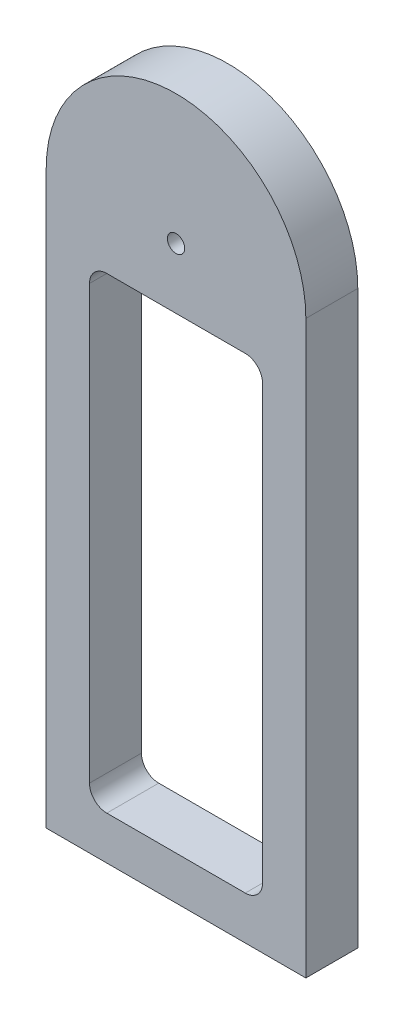
ISO-10303-21;
HEADER;
FILE_DESCRIPTION(('STEP AP214'),'2;1');
FILE_NAME('part.step','',(''),(''),'','','');
FILE_SCHEMA(('AUTOMOTIVE_DESIGN { 1 0 10303 214 1 1 1 1 }'));
ENDSEC;
DATA;
#1=APPLICATION_CONTEXT('core data for automotive mechanical design processes');
#2=APPLICATION_PROTOCOL_DEFINITION('international standard','automotive_design',2000,#1);
#3=PRODUCT_CONTEXT('',#1,'mechanical');
#4=PRODUCT('Part','Part','',(#3));
#5=PRODUCT_RELATED_PRODUCT_CATEGORY('part','',(#4));
#6=PRODUCT_DEFINITION_FORMATION('','',#4);
#7=PRODUCT_DEFINITION_CONTEXT('part definition',#1,'design');
#8=PRODUCT_DEFINITION('design','',#6,#7);
#9=PRODUCT_DEFINITION_SHAPE('','',#8);
#10=(LENGTH_UNIT() NAMED_UNIT(*) SI_UNIT(.MILLI.,.METRE.));
#11=(NAMED_UNIT(*) PLANE_ANGLE_UNIT() SI_UNIT($,.RADIAN.));
#12=(NAMED_UNIT(*) SI_UNIT($,.STERADIAN.) SOLID_ANGLE_UNIT());
#13=UNCERTAINTY_MEASURE_WITH_UNIT(LENGTH_MEASURE(1.E-05),#10,'distance_accuracy_value','');
#14=(GEOMETRIC_REPRESENTATION_CONTEXT(3) GLOBAL_UNCERTAINTY_ASSIGNED_CONTEXT((#13)) GLOBAL_UNIT_ASSIGNED_CONTEXT((#10,
#11,#12)) REPRESENTATION_CONTEXT('',''));
#15=CARTESIAN_POINT('',(0.,0.,0.));
#16=DIRECTION('',(0.,0.,1.));
#17=DIRECTION('',(1.,0.,0.));
#18=AXIS2_PLACEMENT_3D('',#15,#16,#17);
#19=CARTESIAN_POINT('',(75.,330.,30.));
#20=DIRECTION('',(0.,0.,-1.));
#21=DIRECTION('',(-1.,0.,0.));
#22=AXIS2_PLACEMENT_3D('',#19,#20,#21);
#23=CYLINDRICAL_SURFACE('',#22,75.);
#24=CARTESIAN_POINT('',(75.,330.,0.));
#25=DIRECTION('',(0.,0.,1.));
#26=DIRECTION('',(1.,0.,0.));
#27=AXIS2_PLACEMENT_3D('',#24,#25,#26);
#28=CIRCLE('',#27,75.);
#29=CARTESIAN_POINT('',(0.,330.,0.));
#30=VERTEX_POINT('',#29);
#31=CARTESIAN_POINT('',(150.,330.,0.));
#32=VERTEX_POINT('',#31);
#33=EDGE_CURVE('E133',#30,#32,#28,.F.);
#34=ORIENTED_EDGE('',*,*,#33,.F.);
#35=DIRECTION('',(0.,0.,-1.));
#36=VECTOR('',#35,1.);
#37=CARTESIAN_POINT('',(0.,330.,30.));
#38=LINE('',#37,#36);
#39=CARTESIAN_POINT('',(0.,330.,30.));
#40=VERTEX_POINT('',#39);
#41=EDGE_CURVE('E128',#40,#30,#38,.T.);
#42=ORIENTED_EDGE('',*,*,#41,.F.);
#43=CARTESIAN_POINT('',(75.,330.,30.));
#44=DIRECTION('',(0.,0.,1.));
#45=DIRECTION('',(1.,0.,0.));
#46=AXIS2_PLACEMENT_3D('',#43,#44,#45);
#47=CIRCLE('',#46,75.);
#48=CARTESIAN_POINT('',(150.,330.,30.));
#49=VERTEX_POINT('',#48);
#50=EDGE_CURVE('E131',#40,#49,#47,.F.);
#51=ORIENTED_EDGE('',*,*,#50,.T.);
#52=DIRECTION('',(0.,0.,-1.));
#53=VECTOR('',#52,1.);
#54=CARTESIAN_POINT('',(150.,330.,30.));
#55=LINE('',#54,#53);
#56=EDGE_CURVE('E161',#49,#32,#55,.T.);
#57=ORIENTED_EDGE('',*,*,#56,.T.);
#58=EDGE_LOOP('',(#34,#42,#51,#57));
#59=FACE_BOUND('',#58,.T.);
#60=ADVANCED_FACE('F39',(#59),#23,.T.);
#61=CARTESIAN_POINT('',(0.,0.,30.));
#62=DIRECTION('',(1.,0.,0.));
#63=DIRECTION('',(0.,1.,0.));
#64=AXIS2_PLACEMENT_3D('',#61,#62,#63);
#65=PLANE('',#64);
#66=DIRECTION('',(0.,-1.,0.));
#67=VECTOR('',#66,1.);
#68=CARTESIAN_POINT('',(0.,0.,0.));
#69=LINE('',#68,#67);
#70=CARTESIAN_POINT('',(0.,0.,0.));
#71=VERTEX_POINT('',#70);
#72=EDGE_CURVE('E178',#30,#71,#69,.T.);
#73=ORIENTED_EDGE('',*,*,#72,.T.);
#74=DIRECTION('',(0.,0.,-1.));
#75=VECTOR('',#74,1.);
#76=CARTESIAN_POINT('',(0.,0.,30.));
#77=LINE('',#76,#75);
#78=CARTESIAN_POINT('',(0.,0.,30.));
#79=VERTEX_POINT('',#78);
#80=EDGE_CURVE('E138',#79,#71,#77,.T.);
#81=ORIENTED_EDGE('',*,*,#80,.F.);
#82=DIRECTION('',(0.,-1.,0.));
#83=VECTOR('',#82,1.);
#84=CARTESIAN_POINT('',(0.,0.,30.));
#85=LINE('',#84,#83);
#86=EDGE_CURVE('E142',#40,#79,#85,.T.);
#87=ORIENTED_EDGE('',*,*,#86,.F.);
#88=ORIENTED_EDGE('',*,*,#41,.T.);
#89=EDGE_LOOP('',(#73,#81,#87,#88));
#90=FACE_BOUND('',#89,.T.);
#91=ADVANCED_FACE('F143',(#90),#65,.F.);
#92=CARTESIAN_POINT('',(0.,0.,30.));
#93=DIRECTION('',(0.,1.,0.));
#94=DIRECTION('',(0.,0.,1.));
#95=AXIS2_PLACEMENT_3D('',#92,#93,#94);
#96=PLANE('',#95);
#97=DIRECTION('',(1.,0.,0.));
#98=VECTOR('',#97,1.);
#99=CARTESIAN_POINT('',(0.,0.,0.));
#100=LINE('',#99,#98);
#101=CARTESIAN_POINT('',(150.,0.,0.));
#102=VERTEX_POINT('',#101);
#103=EDGE_CURVE('E180',#71,#102,#100,.T.);
#104=ORIENTED_EDGE('',*,*,#103,.T.);
#105=DIRECTION('',(0.,0.,-1.));
#106=VECTOR('',#105,1.);
#107=CARTESIAN_POINT('',(150.,0.,30.));
#108=LINE('',#107,#106);
#109=CARTESIAN_POINT('',(150.,0.,30.));
#110=VERTEX_POINT('',#109);
#111=EDGE_CURVE('E188',#110,#102,#108,.T.);
#112=ORIENTED_EDGE('',*,*,#111,.F.);
#113=DIRECTION('',(1.,0.,0.));
#114=VECTOR('',#113,1.);
#115=CARTESIAN_POINT('',(0.,0.,30.));
#116=LINE('',#115,#114);
#117=EDGE_CURVE('E147',#79,#110,#116,.T.);
#118=ORIENTED_EDGE('',*,*,#117,.F.);
#119=ORIENTED_EDGE('',*,*,#80,.T.);
#120=EDGE_LOOP('',(#104,#112,#118,#119));
#121=FACE_BOUND('',#120,.T.);
#122=ADVANCED_FACE('F276',(#121),#96,.F.);
#123=CARTESIAN_POINT('',(125.,0.,30.));
#124=DIRECTION('',(-1.,0.,0.));
#125=DIRECTION('',(0.,0.,1.));
#126=AXIS2_PLACEMENT_3D('',#123,#124,#125);
#127=PLANE('',#126);
#128=DIRECTION('',(0.,1.,0.));
#129=VECTOR('',#128,1.);
#130=CARTESIAN_POINT('',(125.,0.,0.));
#131=LINE('',#130,#129);
#132=CARTESIAN_POINT('',(125.,35.,0.));
#133=VERTEX_POINT('',#132);
#134=CARTESIAN_POINT('',(125.,285.,0.));
#135=VERTEX_POINT('',#134);
#136=EDGE_CURVE('E162',#133,#135,#131,.T.);
#137=ORIENTED_EDGE('',*,*,#136,.F.);
#138=DIRECTION('',(0.,0.,-1.));
#139=VECTOR('',#138,1.);
#140=CARTESIAN_POINT('',(125.,35.,30.));
#141=LINE('',#140,#139);
#142=CARTESIAN_POINT('',(125.,35.,30.));
#143=VERTEX_POINT('',#142);
#144=EDGE_CURVE('E199',#133,#143,#141,.F.);
#145=ORIENTED_EDGE('',*,*,#144,.T.);
#146=DIRECTION('',(0.,1.,0.));
#147=VECTOR('',#146,1.);
#148=CARTESIAN_POINT('',(125.,0.,30.));
#149=LINE('',#148,#147);
#150=CARTESIAN_POINT('',(125.,285.,30.));
#151=VERTEX_POINT('',#150);
#152=EDGE_CURVE('E186',#143,#151,#149,.T.);
#153=ORIENTED_EDGE('',*,*,#152,.T.);
#154=DIRECTION('',(0.,0.,-1.));
#155=VECTOR('',#154,1.);
#156=CARTESIAN_POINT('',(125.,285.,0.));
#157=LINE('',#156,#155);
#158=EDGE_CURVE('E196',#151,#135,#157,.T.);
#159=ORIENTED_EDGE('',*,*,#158,.T.);
#160=EDGE_LOOP('',(#137,#145,#153,#159));
#161=FACE_BOUND('',#160,.T.);
#162=ADVANCED_FACE('F245',(#161),#127,.T.);
#163=CARTESIAN_POINT('',(0.,25.,30.));
#164=DIRECTION('',(0.,1.,0.));
#165=DIRECTION('',(-1.,0.,0.));
#166=AXIS2_PLACEMENT_3D('',#163,#164,#165);
#167=PLANE('',#166);
#168=DIRECTION('',(1.,0.,0.));
#169=VECTOR('',#168,1.);
#170=CARTESIAN_POINT('',(0.,25.,30.));
#171=LINE('',#170,#169);
#172=CARTESIAN_POINT('',(35.,25.,30.));
#173=VERTEX_POINT('',#172);
#174=CARTESIAN_POINT('',(115.,25.,30.));
#175=VERTEX_POINT('',#174);
#176=EDGE_CURVE('E235',#173,#175,#171,.T.);
#177=ORIENTED_EDGE('',*,*,#176,.T.);
#178=DIRECTION('',(0.,0.,-1.));
#179=VECTOR('',#178,1.);
#180=CARTESIAN_POINT('',(115.,25.,0.));
#181=LINE('',#180,#179);
#182=CARTESIAN_POINT('',(115.,25.,0.));
#183=VERTEX_POINT('',#182);
#184=EDGE_CURVE('E193',#175,#183,#181,.T.);
#185=ORIENTED_EDGE('',*,*,#184,.T.);
#186=DIRECTION('',(1.,0.,0.));
#187=VECTOR('',#186,1.);
#188=CARTESIAN_POINT('',(0.,25.,0.));
#189=LINE('',#188,#187);
#190=CARTESIAN_POINT('',(35.,25.,0.));
#191=VERTEX_POINT('',#190);
#192=EDGE_CURVE('E165',#191,#183,#189,.T.);
#193=ORIENTED_EDGE('',*,*,#192,.F.);
#194=DIRECTION('',(0.,0.,-1.));
#195=VECTOR('',#194,1.);
#196=CARTESIAN_POINT('',(35.,25.,30.));
#197=LINE('',#196,#195);
#198=EDGE_CURVE('E137',#191,#173,#197,.F.);
#199=ORIENTED_EDGE('',*,*,#198,.T.);
#200=EDGE_LOOP('',(#177,#185,#193,#199));
#201=FACE_BOUND('',#200,.T.);
#202=ADVANCED_FACE('F230',(#201),#167,.T.);
#203=CARTESIAN_POINT('',(25.,0.,30.));
#204=DIRECTION('',(1.,0.,0.));
#205=DIRECTION('',(0.,1.,0.));
#206=AXIS2_PLACEMENT_3D('',#203,#204,#205);
#207=PLANE('',#206);
#208=DIRECTION('',(0.,-1.,0.));
#209=VECTOR('',#208,1.);
#210=CARTESIAN_POINT('',(25.,0.,0.));
#211=LINE('',#210,#209);
#212=CARTESIAN_POINT('',(24.9999999999999,285.,0.));
#213=VERTEX_POINT('',#212);
#214=CARTESIAN_POINT('',(25.,35.,0.));
#215=VERTEX_POINT('',#214);
#216=EDGE_CURVE('E168',#213,#215,#211,.T.);
#217=ORIENTED_EDGE('',*,*,#216,.F.);
#218=DIRECTION('',(0.,0.,-1.));
#219=VECTOR('',#218,1.);
#220=CARTESIAN_POINT('',(24.9999999999999,285.,30.));
#221=LINE('',#220,#219);
#222=CARTESIAN_POINT('',(24.9999999999999,285.,30.));
#223=VERTEX_POINT('',#222);
#224=EDGE_CURVE('E59',#213,#223,#221,.F.);
#225=ORIENTED_EDGE('',*,*,#224,.T.);
#226=DIRECTION('',(0.,-1.,0.));
#227=VECTOR('',#226,1.);
#228=CARTESIAN_POINT('',(25.,0.,30.));
#229=LINE('',#228,#227);
#230=CARTESIAN_POINT('',(25.,35.,30.));
#231=VERTEX_POINT('',#230);
#232=EDGE_CURVE('E233',#223,#231,#229,.T.);
#233=ORIENTED_EDGE('',*,*,#232,.T.);
#234=DIRECTION('',(0.,0.,-1.));
#235=VECTOR('',#234,1.);
#236=CARTESIAN_POINT('',(25.,35.,0.));
#237=LINE('',#236,#235);
#238=EDGE_CURVE('E206',#231,#215,#237,.T.);
#239=ORIENTED_EDGE('',*,*,#238,.T.);
#240=EDGE_LOOP('',(#217,#225,#233,#239));
#241=FACE_BOUND('',#240,.T.);
#242=ADVANCED_FACE('F232',(#241),#207,.T.);
#243=CARTESIAN_POINT('',(75.,330.,30.));
#244=DIRECTION('',(0.,0.,-1.));
#245=DIRECTION('',(-1.,0.,0.));
#246=AXIS2_PLACEMENT_3D('',#243,#244,#245);
#247=CYLINDRICAL_SURFACE('',#246,5.00000000000001);
#248=CARTESIAN_POINT('',(75.,330.,30.));
#249=DIRECTION('',(0.,0.,1.));
#250=DIRECTION('',(1.,0.,0.));
#251=AXIS2_PLACEMENT_3D('',#248,#249,#250);
#252=CIRCLE('',#251,5.00000000000001);
#253=CARTESIAN_POINT('',(80.,330.,30.));
#254=VERTEX_POINT('',#253);
#255=EDGE_CURVE('E152',#254,#254,#252,.T.);
#256=ORIENTED_EDGE('',*,*,#255,.T.);
#257=EDGE_LOOP('',(#256));
#258=FACE_BOUND('',#257,.T.);
#259=CARTESIAN_POINT('',(75.,330.,0.));
#260=DIRECTION('',(0.,0.,1.));
#261=DIRECTION('',(1.,0.,0.));
#262=AXIS2_PLACEMENT_3D('',#259,#260,#261);
#263=CIRCLE('',#262,5.00000000000001);
#264=CARTESIAN_POINT('',(80.,330.,0.));
#265=VERTEX_POINT('',#264);
#266=EDGE_CURVE('E174',#265,#265,#263,.T.);
#267=ORIENTED_EDGE('',*,*,#266,.F.);
#268=EDGE_LOOP('',(#267));
#269=FACE_BOUND('',#268,.T.);
#270=ADVANCED_FACE('F265',(#258,#269),#247,.F.);
#271=CARTESIAN_POINT('',(0.,295.,30.));
#272=DIRECTION('',(0.,-1.,0.));
#273=DIRECTION('',(0.,0.,-1.));
#274=AXIS2_PLACEMENT_3D('',#271,#272,#273);
#275=PLANE('',#274);
#276=DIRECTION('',(-1.,0.,0.));
#277=VECTOR('',#276,1.);
#278=CARTESIAN_POINT('',(0.,295.,0.));
#279=LINE('',#278,#277);
#280=CARTESIAN_POINT('',(115.,295.,0.));
#281=VERTEX_POINT('',#280);
#282=CARTESIAN_POINT('',(34.9999999999999,295.,0.));
#283=VERTEX_POINT('',#282);
#284=EDGE_CURVE('E171',#281,#283,#279,.T.);
#285=ORIENTED_EDGE('',*,*,#284,.F.);
#286=DIRECTION('',(0.,0.,-1.));
#287=VECTOR('',#286,1.);
#288=CARTESIAN_POINT('',(115.,295.,30.));
#289=LINE('',#288,#287);
#290=CARTESIAN_POINT('',(115.,295.,30.));
#291=VERTEX_POINT('',#290);
#292=EDGE_CURVE('E204',#281,#291,#289,.F.);
#293=ORIENTED_EDGE('',*,*,#292,.T.);
#294=DIRECTION('',(-1.,0.,0.));
#295=VECTOR('',#294,1.);
#296=CARTESIAN_POINT('',(0.,295.,30.));
#297=LINE('',#296,#295);
#298=CARTESIAN_POINT('',(34.9999999999999,295.,30.));
#299=VERTEX_POINT('',#298);
#300=EDGE_CURVE('E155',#291,#299,#297,.T.);
#301=ORIENTED_EDGE('',*,*,#300,.T.);
#302=DIRECTION('',(0.,0.,-1.));
#303=VECTOR('',#302,1.);
#304=CARTESIAN_POINT('',(34.9999999999999,295.,0.));
#305=LINE('',#304,#303);
#306=EDGE_CURVE('E201',#299,#283,#305,.T.);
#307=ORIENTED_EDGE('',*,*,#306,.T.);
#308=EDGE_LOOP('',(#285,#293,#301,#307));
#309=FACE_BOUND('',#308,.T.);
#310=ADVANCED_FACE('F254',(#309),#275,.T.);
#311=CARTESIAN_POINT('',(150.,0.,30.));
#312=DIRECTION('',(-1.,0.,0.));
#313=DIRECTION('',(0.,-1.,0.));
#314=AXIS2_PLACEMENT_3D('',#311,#312,#313);
#315=PLANE('',#314);
#316=DIRECTION('',(0.,1.,0.));
#317=VECTOR('',#316,1.);
#318=CARTESIAN_POINT('',(150.,0.,0.));
#319=LINE('',#318,#317);
#320=EDGE_CURVE('E183',#102,#32,#319,.T.);
#321=ORIENTED_EDGE('',*,*,#320,.T.);
#322=ORIENTED_EDGE('',*,*,#56,.F.);
#323=DIRECTION('',(0.,1.,0.));
#324=VECTOR('',#323,1.);
#325=CARTESIAN_POINT('',(150.,0.,30.));
#326=LINE('',#325,#324);
#327=EDGE_CURVE('E150',#110,#49,#326,.T.);
#328=ORIENTED_EDGE('',*,*,#327,.F.);
#329=ORIENTED_EDGE('',*,*,#111,.T.);
#330=EDGE_LOOP('',(#321,#322,#328,#329));
#331=FACE_BOUND('',#330,.T.);
#332=ADVANCED_FACE('F261',(#331),#315,.F.);
#333=CARTESIAN_POINT('',(0.,0.,30.));
#334=DIRECTION('',(0.,0.,1.));
#335=DIRECTION('',(1.,0.,0.));
#336=AXIS2_PLACEMENT_3D('',#333,#334,#335);
#337=PLANE('',#336);
#338=ORIENTED_EDGE('',*,*,#152,.F.);
#339=CARTESIAN_POINT('',(115.,35.,30.));
#340=DIRECTION('',(0.,0.,1.));
#341=DIRECTION('',(1.,0.,0.));
#342=AXIS2_PLACEMENT_3D('',#339,#340,#341);
#343=CIRCLE('',#342,10.);
#344=EDGE_CURVE('E212',#143,#175,#343,.F.);
#345=ORIENTED_EDGE('',*,*,#344,.T.);
#346=ORIENTED_EDGE('',*,*,#176,.F.);
#347=CARTESIAN_POINT('',(35.,35.,30.));
#348=DIRECTION('',(0.,0.,1.));
#349=DIRECTION('',(1.,0.,0.));
#350=AXIS2_PLACEMENT_3D('',#347,#348,#349);
#351=CIRCLE('',#350,10.);
#352=EDGE_CURVE('E11',#173,#231,#351,.F.);
#353=ORIENTED_EDGE('',*,*,#352,.T.);
#354=ORIENTED_EDGE('',*,*,#232,.F.);
#355=CARTESIAN_POINT('',(34.9999999999999,285.,30.));
#356=DIRECTION('',(0.,0.,1.));
#357=DIRECTION('',(1.,0.,0.));
#358=AXIS2_PLACEMENT_3D('',#355,#356,#357);
#359=CIRCLE('',#358,10.);
#360=EDGE_CURVE('E220',#223,#299,#359,.F.);
#361=ORIENTED_EDGE('',*,*,#360,.T.);
#362=ORIENTED_EDGE('',*,*,#300,.F.);
#363=CARTESIAN_POINT('',(115.,285.,30.));
#364=DIRECTION('',(0.,0.,1.));
#365=DIRECTION('',(1.,0.,0.));
#366=AXIS2_PLACEMENT_3D('',#363,#364,#365);
#367=CIRCLE('',#366,10.);
#368=EDGE_CURVE('E216',#291,#151,#367,.F.);
#369=ORIENTED_EDGE('',*,*,#368,.T.);
#370=EDGE_LOOP('',(#338,#345,#346,#353,#354,#361,#362,#369));
#371=FACE_BOUND('',#370,.T.);
#372=ORIENTED_EDGE('',*,*,#255,.F.);
#373=EDGE_LOOP('',(#372));
#374=FACE_BOUND('',#373,.T.);
#375=ORIENTED_EDGE('',*,*,#50,.F.);
#376=ORIENTED_EDGE('',*,*,#86,.T.);
#377=ORIENTED_EDGE('',*,*,#117,.T.);
#378=ORIENTED_EDGE('',*,*,#327,.T.);
#379=EDGE_LOOP('',(#375,#376,#377,#378));
#380=FACE_BOUND('',#379,.T.);
#381=ADVANCED_FACE('F149',(#371,#374,#380),#337,.T.);
#382=CARTESIAN_POINT('',(0.,0.,0.));
#383=DIRECTION('',(0.,0.,1.));
#384=DIRECTION('',(1.,0.,0.));
#385=AXIS2_PLACEMENT_3D('',#382,#383,#384);
#386=PLANE('',#385);
#387=ORIENTED_EDGE('',*,*,#192,.T.);
#388=CARTESIAN_POINT('',(115.,35.,0.));
#389=DIRECTION('',(0.,0.,1.));
#390=DIRECTION('',(1.,0.,0.));
#391=AXIS2_PLACEMENT_3D('',#388,#389,#390);
#392=CIRCLE('',#391,10.);
#393=EDGE_CURVE('E210',#183,#133,#392,.T.);
#394=ORIENTED_EDGE('',*,*,#393,.T.);
#395=ORIENTED_EDGE('',*,*,#136,.T.);
#396=CARTESIAN_POINT('',(115.,285.,0.));
#397=DIRECTION('',(0.,0.,1.));
#398=DIRECTION('',(1.,0.,0.));
#399=AXIS2_PLACEMENT_3D('',#396,#397,#398);
#400=CIRCLE('',#399,10.);
#401=EDGE_CURVE('E214',#135,#281,#400,.T.);
#402=ORIENTED_EDGE('',*,*,#401,.T.);
#403=ORIENTED_EDGE('',*,*,#284,.T.);
#404=CARTESIAN_POINT('',(34.9999999999999,285.,0.));
#405=DIRECTION('',(0.,0.,1.));
#406=DIRECTION('',(1.,0.,0.));
#407=AXIS2_PLACEMENT_3D('',#404,#405,#406);
#408=CIRCLE('',#407,10.);
#409=EDGE_CURVE('E218',#283,#213,#408,.T.);
#410=ORIENTED_EDGE('',*,*,#409,.T.);
#411=ORIENTED_EDGE('',*,*,#216,.T.);
#412=CARTESIAN_POINT('',(35.,35.,0.));
#413=DIRECTION('',(0.,0.,1.));
#414=DIRECTION('',(1.,0.,0.));
#415=AXIS2_PLACEMENT_3D('',#412,#413,#414);
#416=CIRCLE('',#415,10.);
#417=EDGE_CURVE('E47',#215,#191,#416,.T.);
#418=ORIENTED_EDGE('',*,*,#417,.T.);
#419=EDGE_LOOP('',(#387,#394,#395,#402,#403,#410,#411,#418));
#420=FACE_BOUND('',#419,.T.);
#421=ORIENTED_EDGE('',*,*,#266,.T.);
#422=EDGE_LOOP('',(#421));
#423=FACE_BOUND('',#422,.T.);
#424=ORIENTED_EDGE('',*,*,#33,.T.);
#425=ORIENTED_EDGE('',*,*,#320,.F.);
#426=ORIENTED_EDGE('',*,*,#103,.F.);
#427=ORIENTED_EDGE('',*,*,#72,.F.);
#428=EDGE_LOOP('',(#424,#425,#426,#427));
#429=FACE_BOUND('',#428,.T.);
#430=ADVANCED_FACE('F223',(#420,#423,#429),#386,.F.);
#431=CARTESIAN_POINT('',(115.,35.,30.));
#432=DIRECTION('',(0.,0.,1.));
#433=DIRECTION('',(1.,0.,0.));
#434=AXIS2_PLACEMENT_3D('',#431,#432,#433);
#435=CYLINDRICAL_SURFACE('',#434,10.);
#436=ORIENTED_EDGE('',*,*,#344,.F.);
#437=ORIENTED_EDGE('',*,*,#144,.F.);
#438=ORIENTED_EDGE('',*,*,#393,.F.);
#439=ORIENTED_EDGE('',*,*,#184,.F.);
#440=EDGE_LOOP('',(#436,#437,#438,#439));
#441=FACE_BOUND('',#440,.T.);
#442=ADVANCED_FACE('F272',(#441),#435,.F.);
#443=CARTESIAN_POINT('',(115.,285.,30.));
#444=DIRECTION('',(0.,0.,1.));
#445=DIRECTION('',(1.,0.,0.));
#446=AXIS2_PLACEMENT_3D('',#443,#444,#445);
#447=CYLINDRICAL_SURFACE('',#446,10.);
#448=ORIENTED_EDGE('',*,*,#368,.F.);
#449=ORIENTED_EDGE('',*,*,#292,.F.);
#450=ORIENTED_EDGE('',*,*,#401,.F.);
#451=ORIENTED_EDGE('',*,*,#158,.F.);
#452=EDGE_LOOP('',(#448,#449,#450,#451));
#453=FACE_BOUND('',#452,.T.);
#454=ADVANCED_FACE('F250',(#453),#447,.F.);
#455=CARTESIAN_POINT('',(34.9999999999999,285.,30.));
#456=DIRECTION('',(0.,0.,1.));
#457=DIRECTION('',(1.,0.,0.));
#458=AXIS2_PLACEMENT_3D('',#455,#456,#457);
#459=CYLINDRICAL_SURFACE('',#458,10.);
#460=ORIENTED_EDGE('',*,*,#360,.F.);
#461=ORIENTED_EDGE('',*,*,#224,.F.);
#462=ORIENTED_EDGE('',*,*,#409,.F.);
#463=ORIENTED_EDGE('',*,*,#306,.F.);
#464=EDGE_LOOP('',(#460,#461,#462,#463));
#465=FACE_BOUND('',#464,.T.);
#466=ADVANCED_FACE('F258',(#465),#459,.F.);
#467=CARTESIAN_POINT('',(35.,35.,30.));
#468=DIRECTION('',(0.,0.,1.));
#469=DIRECTION('',(1.,0.,0.));
#470=AXIS2_PLACEMENT_3D('',#467,#468,#469);
#471=CYLINDRICAL_SURFACE('',#470,10.);
#472=ORIENTED_EDGE('',*,*,#352,.F.);
#473=ORIENTED_EDGE('',*,*,#198,.F.);
#474=ORIENTED_EDGE('',*,*,#417,.F.);
#475=ORIENTED_EDGE('',*,*,#238,.F.);
#476=EDGE_LOOP('',(#472,#473,#474,#475));
#477=FACE_BOUND('',#476,.T.);
#478=ADVANCED_FACE('F41',(#477),#471,.F.);
#479=CLOSED_SHELL('',(#60,#91,#122,#162,#202,#242,#270,#310,#332,#381,#430,#442,#454,#466,#478));
#480=MANIFOLD_SOLID_BREP('B2',#479);
#481=ADVANCED_BREP_SHAPE_REPRESENTATION('',(#18,#480),#14);
#482=SHAPE_DEFINITION_REPRESENTATION(#9,#481);
ENDSEC;
END-ISO-10303-21;
